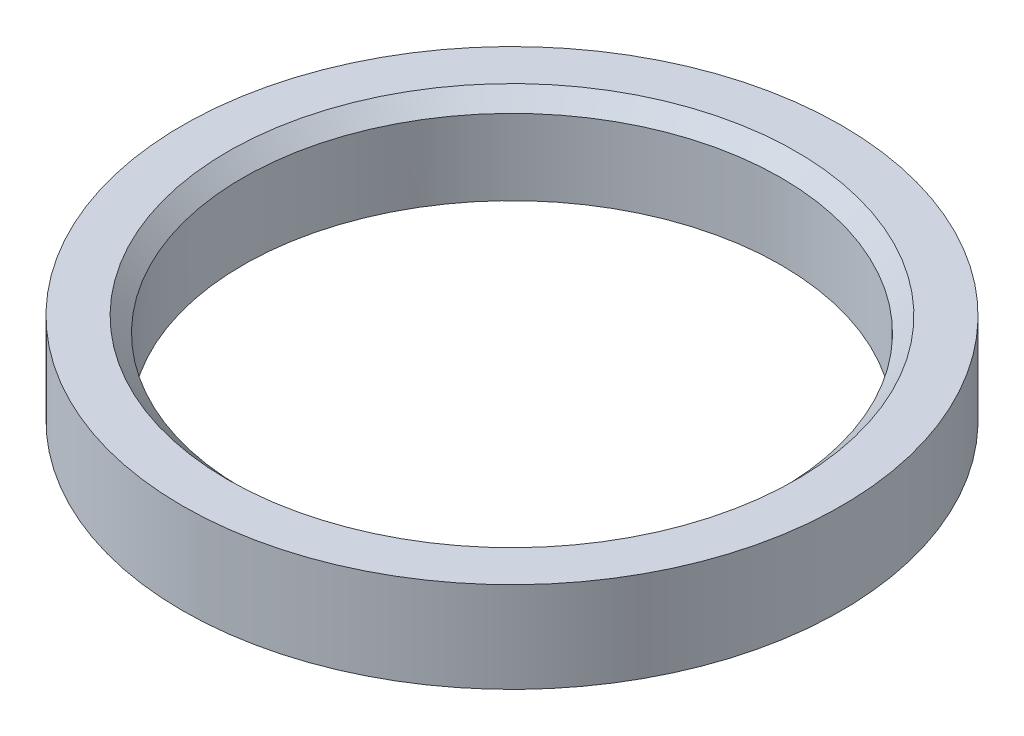
ISO-10303-21;
HEADER;
FILE_DESCRIPTION(('STEP AP214'),'2;1');
FILE_NAME('part.step','',(''),(''),'','','');
FILE_SCHEMA(('AUTOMOTIVE_DESIGN { 1 0 10303 214 1 1 1 1 }'));
ENDSEC;
DATA;
#1=APPLICATION_CONTEXT('core data for automotive mechanical design processes');
#2=APPLICATION_PROTOCOL_DEFINITION('international standard','automotive_design',2000,#1);
#3=PRODUCT_CONTEXT('',#1,'mechanical');
#4=PRODUCT('Part','Part','',(#3));
#5=PRODUCT_RELATED_PRODUCT_CATEGORY('part','',(#4));
#6=PRODUCT_DEFINITION_FORMATION('','',#4);
#7=PRODUCT_DEFINITION_CONTEXT('part definition',#1,'design');
#8=PRODUCT_DEFINITION('design','',#6,#7);
#9=PRODUCT_DEFINITION_SHAPE('','',#8);
#10=(LENGTH_UNIT() NAMED_UNIT(*) SI_UNIT(.MILLI.,.METRE.));
#11=(NAMED_UNIT(*) PLANE_ANGLE_UNIT() SI_UNIT($,.RADIAN.));
#12=(NAMED_UNIT(*) SI_UNIT($,.STERADIAN.) SOLID_ANGLE_UNIT());
#13=UNCERTAINTY_MEASURE_WITH_UNIT(LENGTH_MEASURE(1.E-05),#10,'distance_accuracy_value','');
#14=(GEOMETRIC_REPRESENTATION_CONTEXT(3) GLOBAL_UNCERTAINTY_ASSIGNED_CONTEXT((#13)) GLOBAL_UNIT_ASSIGNED_CONTEXT((#10,
#11,#12)) REPRESENTATION_CONTEXT('',''));
#15=CARTESIAN_POINT('',(0.,0.,0.));
#16=DIRECTION('',(0.,0.,1.));
#17=DIRECTION('',(1.,0.,0.));
#18=AXIS2_PLACEMENT_3D('',#15,#16,#17);
#19=CARTESIAN_POINT('',(0.,0.,0.));
#20=DIRECTION('',(0.,-1.,0.));
#21=DIRECTION('',(0.,0.,-1.));
#22=AXIS2_PLACEMENT_3D('',#19,#20,#21);
#23=CYLINDRICAL_SURFACE('',#22,8.9);
#24=CARTESIAN_POINT('',(0.,2.5,0.));
#25=DIRECTION('',(0.,1.,0.));
#26=DIRECTION('',(0.,0.,1.));
#27=AXIS2_PLACEMENT_3D('',#24,#25,#26);
#28=CIRCLE('',#27,8.9);
#29=CARTESIAN_POINT('',(0.,2.5,8.9));
#30=VERTEX_POINT('',#29);
#31=EDGE_CURVE('E10',#30,#30,#28,.T.);
#32=ORIENTED_EDGE('',*,*,#31,.T.);
#33=EDGE_LOOP('',(#32));
#34=FACE_BOUND('',#33,.T.);
#35=CARTESIAN_POINT('',(0.,0.,0.));
#36=DIRECTION('',(0.,-1.,0.));
#37=DIRECTION('',(0.,0.,-1.));
#38=AXIS2_PLACEMENT_3D('',#35,#36,#37);
#39=CIRCLE('',#38,8.9);
#40=CARTESIAN_POINT('',(0.,0.,-8.9));
#41=VERTEX_POINT('',#40);
#42=EDGE_CURVE('E70',#41,#41,#39,.T.);
#43=ORIENTED_EDGE('',*,*,#42,.T.);
#44=EDGE_LOOP('',(#43));
#45=FACE_BOUND('',#44,.T.);
#46=ADVANCED_FACE('F45',(#34,#45),#23,.F.);
#47=CARTESIAN_POINT('',(8.9,3.,0.));
#48=DIRECTION('',(0.,1.,0.));
#49=DIRECTION('',(0.,0.,1.));
#50=AXIS2_PLACEMENT_3D('',#47,#48,#49);
#51=PLANE('',#50);
#52=CARTESIAN_POINT('',(0.,3.,0.));
#53=DIRECTION('',(0.,1.,0.));
#54=DIRECTION('',(0.,0.,1.));
#55=AXIS2_PLACEMENT_3D('',#52,#53,#54);
#56=CIRCLE('',#55,9.4);
#57=CARTESIAN_POINT('',(0.,3.,9.4));
#58=VERTEX_POINT('',#57);
#59=EDGE_CURVE('E54',#58,#58,#56,.F.);
#60=ORIENTED_EDGE('',*,*,#59,.T.);
#61=EDGE_LOOP('',(#60));
#62=FACE_BOUND('',#61,.T.);
#63=CARTESIAN_POINT('',(0.,3.,0.));
#64=DIRECTION('',(0.,-1.,0.));
#65=DIRECTION('',(0.,0.,-1.));
#66=AXIS2_PLACEMENT_3D('',#63,#64,#65);
#67=CIRCLE('',#66,10.9);
#68=CARTESIAN_POINT('',(0.,3.,-10.9));
#69=VERTEX_POINT('',#68);
#70=EDGE_CURVE('E59',#69,#69,#67,.T.);
#71=ORIENTED_EDGE('',*,*,#70,.F.);
#72=EDGE_LOOP('',(#71));
#73=FACE_BOUND('',#72,.T.);
#74=ADVANCED_FACE('F86',(#62,#73),#51,.T.);
#75=CARTESIAN_POINT('',(0.,0.,0.));
#76=DIRECTION('',(0.,-1.,0.));
#77=DIRECTION('',(0.,0.,-1.));
#78=AXIS2_PLACEMENT_3D('',#75,#76,#77);
#79=CYLINDRICAL_SURFACE('',#78,10.9);
#80=ORIENTED_EDGE('',*,*,#70,.T.);
#81=EDGE_LOOP('',(#80));
#82=FACE_BOUND('',#81,.T.);
#83=CARTESIAN_POINT('',(0.,0.,0.));
#84=DIRECTION('',(0.,-1.,0.));
#85=DIRECTION('',(0.,0.,-1.));
#86=AXIS2_PLACEMENT_3D('',#83,#84,#85);
#87=CIRCLE('',#86,10.9);
#88=CARTESIAN_POINT('',(0.,0.,-10.9));
#89=VERTEX_POINT('',#88);
#90=EDGE_CURVE('E64',#89,#89,#87,.T.);
#91=ORIENTED_EDGE('',*,*,#90,.F.);
#92=EDGE_LOOP('',(#91));
#93=FACE_BOUND('',#92,.T.);
#94=ADVANCED_FACE('F78',(#82,#93),#79,.T.);
#95=CARTESIAN_POINT('',(8.9,0.,0.));
#96=DIRECTION('',(0.,-1.,0.));
#97=DIRECTION('',(0.,0.,-1.));
#98=AXIS2_PLACEMENT_3D('',#95,#96,#97);
#99=PLANE('',#98);
#100=ORIENTED_EDGE('',*,*,#90,.T.);
#101=EDGE_LOOP('',(#100));
#102=FACE_BOUND('',#101,.T.);
#103=ORIENTED_EDGE('',*,*,#42,.F.);
#104=EDGE_LOOP('',(#103));
#105=FACE_BOUND('',#104,.T.);
#106=ADVANCED_FACE('F76',(#102,#105),#99,.T.);
#107=CARTESIAN_POINT('',(0.,3.,0.));
#108=DIRECTION('',(0.,1.,0.));
#109=DIRECTION('',(0.,0.,1.));
#110=AXIS2_PLACEMENT_3D('',#107,#108,#109);
#111=CONICAL_SURFACE('',#110,9.4,0.785398163397448);
#112=ORIENTED_EDGE('',*,*,#31,.F.);
#113=EDGE_LOOP('',(#112));
#114=FACE_BOUND('',#113,.T.);
#115=ORIENTED_EDGE('',*,*,#59,.F.);
#116=EDGE_LOOP('',(#115));
#117=FACE_BOUND('',#116,.T.);
#118=ADVANCED_FACE('F48',(#114,#117),#111,.F.);
#119=CLOSED_SHELL('',(#46,#74,#94,#106,#118));
#120=MANIFOLD_SOLID_BREP('B2',#119);
#121=ADVANCED_BREP_SHAPE_REPRESENTATION('',(#18,#120),#14);
#122=SHAPE_DEFINITION_REPRESENTATION(#9,#121);
ENDSEC;
END-ISO-10303-21;
